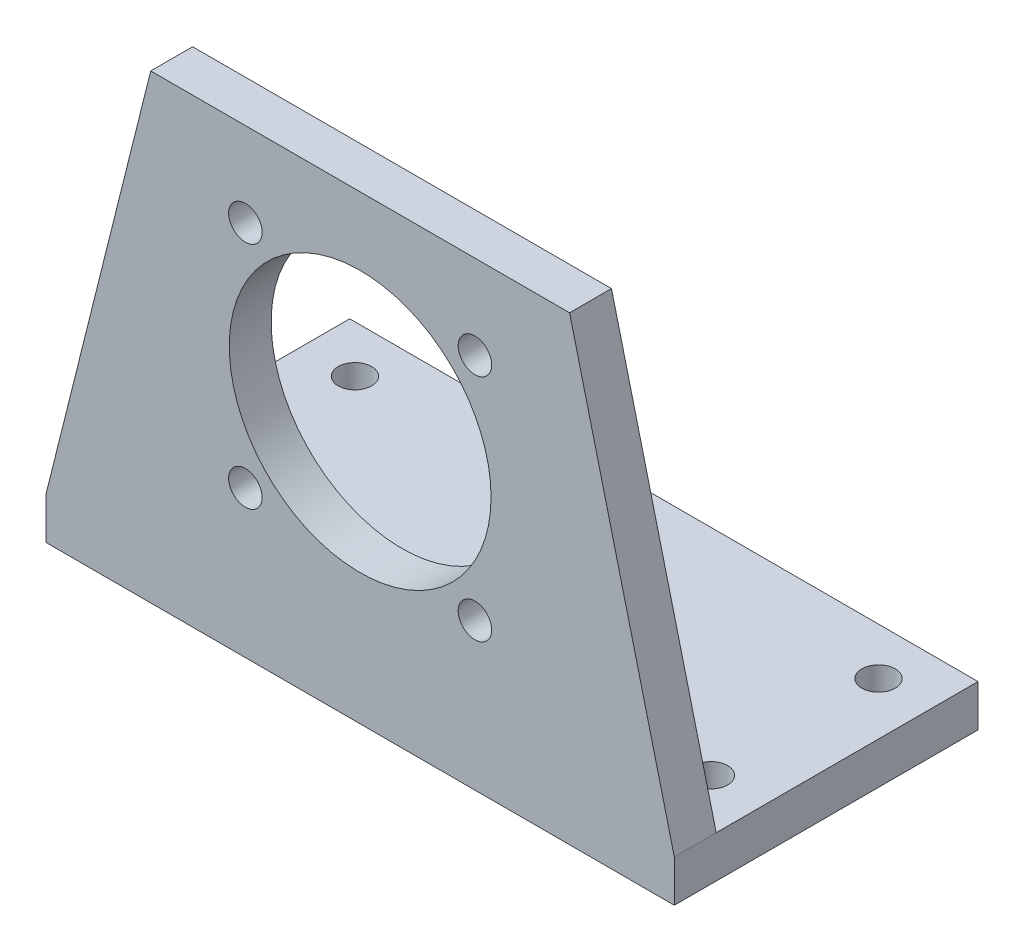
ISO-10303-21;
HEADER;
FILE_DESCRIPTION(('STEP AP214'),'2;1');
FILE_NAME('part.step','',(''),(''),'','','');
FILE_SCHEMA(('AUTOMOTIVE_DESIGN { 1 0 10303 214 1 1 1 1 }'));
ENDSEC;
DATA;
#1=APPLICATION_CONTEXT('core data for automotive mechanical design processes');
#2=APPLICATION_PROTOCOL_DEFINITION('international standard','automotive_design',2000,#1);
#3=PRODUCT_CONTEXT('',#1,'mechanical');
#4=PRODUCT('Part','Part','',(#3));
#5=PRODUCT_RELATED_PRODUCT_CATEGORY('part','',(#4));
#6=PRODUCT_DEFINITION_FORMATION('','',#4);
#7=PRODUCT_DEFINITION_CONTEXT('part definition',#1,'design');
#8=PRODUCT_DEFINITION('design','',#6,#7);
#9=PRODUCT_DEFINITION_SHAPE('','',#8);
#10=(LENGTH_UNIT() NAMED_UNIT(*) SI_UNIT(.MILLI.,.METRE.));
#11=(NAMED_UNIT(*) PLANE_ANGLE_UNIT() SI_UNIT($,.RADIAN.));
#12=(NAMED_UNIT(*) SI_UNIT($,.STERADIAN.) SOLID_ANGLE_UNIT());
#13=UNCERTAINTY_MEASURE_WITH_UNIT(LENGTH_MEASURE(1.E-05),#10,'distance_accuracy_value','');
#14=(GEOMETRIC_REPRESENTATION_CONTEXT(3) GLOBAL_UNCERTAINTY_ASSIGNED_CONTEXT((#13)) GLOBAL_UNIT_ASSIGNED_CONTEXT((#10,
#11,#12)) REPRESENTATION_CONTEXT('',''));
#15=CARTESIAN_POINT('',(0.,0.,0.));
#16=DIRECTION('',(0.,0.,1.));
#17=DIRECTION('',(1.,0.,0.));
#18=AXIS2_PLACEMENT_3D('',#15,#16,#17);
#19=CARTESIAN_POINT('',(0.,0.,0.));
#20=DIRECTION('',(0.,0.,1.));
#21=DIRECTION('',(1.,0.,0.));
#22=AXIS2_PLACEMENT_3D('',#19,#20,#21);
#23=PLANE('',#22);
#24=CARTESIAN_POINT('',(14.1721015894927,10.9601551083911,0.));
#25=DIRECTION('',(0.,0.,1.));
#26=DIRECTION('',(1.,0.,0.));
#27=AXIS2_PLACEMENT_3D('',#24,#25,#26);
#28=CIRCLE('',#27,1.59999999999982);
#29=CARTESIAN_POINT('',(15.7721015894925,10.9601551083911,0.));
#30=VERTEX_POINT('',#29);
#31=EDGE_CURVE('E136',#30,#30,#28,.T.);
#32=ORIENTED_EDGE('',*,*,#31,.T.);
#33=EDGE_LOOP('',(#32));
#34=FACE_BOUND('',#33,.T.);
#35=CARTESIAN_POINT('',(3.21194648110178,2.22044604925031E-13,0.));
#36=DIRECTION('',(0.,0.,1.));
#37=DIRECTION('',(1.,0.,0.));
#38=AXIS2_PLACEMENT_3D('',#35,#36,#37);
#39=CIRCLE('',#38,12.5000000000011);
#40=CARTESIAN_POINT('',(15.7119464811028,2.22044604925031E-13,0.));
#41=VERTEX_POINT('',#40);
#42=EDGE_CURVE('E133',#41,#41,#39,.T.);
#43=ORIENTED_EDGE('',*,*,#42,.T.);
#44=EDGE_LOOP('',(#43));
#45=FACE_BOUND('',#44,.T.);
#46=CARTESIAN_POINT('',(-7.74820862728909,10.960155108392,0.));
#47=DIRECTION('',(0.,0.,1.));
#48=DIRECTION('',(1.,0.,0.));
#49=AXIS2_PLACEMENT_3D('',#46,#47,#48);
#50=CIRCLE('',#49,1.59999999999982);
#51=CARTESIAN_POINT('',(-6.14820862728926,10.960155108392,0.));
#52=VERTEX_POINT('',#51);
#53=EDGE_CURVE('E130',#52,#52,#50,.T.);
#54=ORIENTED_EDGE('',*,*,#53,.T.);
#55=EDGE_LOOP('',(#54));
#56=FACE_BOUND('',#55,.T.);
#57=CARTESIAN_POINT('',(-7.74820862728908,-10.9601551083911,0.));
#58=DIRECTION('',(0.,0.,1.));
#59=DIRECTION('',(1.,0.,0.));
#60=AXIS2_PLACEMENT_3D('',#57,#58,#59);
#61=CIRCLE('',#60,1.59999999999982);
#62=CARTESIAN_POINT('',(-6.14820862728926,-10.9601551083911,0.));
#63=VERTEX_POINT('',#62);
#64=EDGE_CURVE('E126',#63,#63,#61,.T.);
#65=ORIENTED_EDGE('',*,*,#64,.T.);
#66=EDGE_LOOP('',(#65));
#67=FACE_BOUND('',#66,.T.);
#68=CARTESIAN_POINT('',(14.1721015894936,-10.9601551083915,0.));
#69=DIRECTION('',(0.,0.,1.));
#70=DIRECTION('',(1.,0.,0.));
#71=AXIS2_PLACEMENT_3D('',#68,#69,#70);
#72=CIRCLE('',#71,1.59999999999982);
#73=CARTESIAN_POINT('',(15.7721015894934,-10.9601551083915,0.));
#74=VERTEX_POINT('',#73);
#75=EDGE_CURVE('E123',#74,#74,#72,.T.);
#76=ORIENTED_EDGE('',*,*,#75,.T.);
#77=EDGE_LOOP('',(#76));
#78=FACE_BOUND('',#77,.T.);
#79=DIRECTION('',(1.,0.,0.));
#80=VECTOR('',#79,1.);
#81=CARTESIAN_POINT('',(33.2119464811003,-20.9999999999997,0.));
#82=LINE('',#81,#80);
#83=CARTESIAN_POINT('',(-26.7880535188993,-21.0000000000001,0.));
#84=VERTEX_POINT('',#83);
#85=CARTESIAN_POINT('',(33.2119464811003,-20.9999999999997,0.));
#86=VERTEX_POINT('',#85);
#87=EDGE_CURVE('E68',#84,#86,#82,.T.);
#88=ORIENTED_EDGE('',*,*,#87,.F.);
#89=DIRECTION('',(-0.242535625036366,-0.970142500145324,0.));
#90=VECTOR('',#89,1.);
#91=CARTESIAN_POINT('',(-20.271109194257,5.06777729856545,0.));
#92=LINE('',#91,#90);
#93=CARTESIAN_POINT('',(-16.7880535188978,19.0000000000003,0.));
#94=VERTEX_POINT('',#93);
#95=EDGE_CURVE('E142',#94,#84,#92,.T.);
#96=ORIENTED_EDGE('',*,*,#95,.F.);
#97=DIRECTION('',(-1.,0.,0.));
#98=VECTOR('',#97,1.);
#99=CARTESIAN_POINT('',(0.,18.9999999999999,0.));
#100=LINE('',#99,#98);
#101=CARTESIAN_POINT('',(23.2119464811022,18.9999999999999,0.));
#102=VERTEX_POINT('',#101);
#103=EDGE_CURVE('E139',#102,#94,#100,.T.);
#104=ORIENTED_EDGE('',*,*,#103,.F.);
#105=DIRECTION('',(-0.242535625036287,0.970142500145343,0.));
#106=VECTOR('',#105,1.);
#107=CARTESIAN_POINT('',(26.3171260998606,6.5792815249639,0.));
#108=LINE('',#107,#106);
#109=EDGE_CURVE('E74',#86,#102,#108,.T.);
#110=ORIENTED_EDGE('',*,*,#109,.F.);
#111=EDGE_LOOP('',(#88,#96,#104,#110));
#112=FACE_BOUND('',#111,.T.);
#113=ADVANCED_FACE('F34',(#34,#45,#56,#67,#78,#112),#23,.F.);
#114=CARTESIAN_POINT('',(0.,18.9999999999999,4.00000000000005));
#115=DIRECTION('',(0.,-1.,0.));
#116=DIRECTION('',(0.,0.,-1.));
#117=AXIS2_PLACEMENT_3D('',#114,#115,#116);
#118=PLANE('',#117);
#119=ORIENTED_EDGE('',*,*,#103,.T.);
#120=DIRECTION('',(0.,0.,-1.));
#121=VECTOR('',#120,1.);
#122=CARTESIAN_POINT('',(-16.7880535188978,19.0000000000003,4.00000000000006));
#123=LINE('',#122,#121);
#124=CARTESIAN_POINT('',(-16.7880535188978,19.0000000000003,4.00000000000006));
#125=VERTEX_POINT('',#124);
#126=EDGE_CURVE('E11',#125,#94,#123,.T.);
#127=ORIENTED_EDGE('',*,*,#126,.F.);
#128=DIRECTION('',(-1.,0.,0.));
#129=VECTOR('',#128,1.);
#130=CARTESIAN_POINT('',(0.,18.9999999999999,4.00000000000005));
#131=LINE('',#130,#129);
#132=CARTESIAN_POINT('',(23.2119464811022,18.9999999999999,4.00000000000006));
#133=VERTEX_POINT('',#132);
#134=EDGE_CURVE('E201',#133,#125,#131,.T.);
#135=ORIENTED_EDGE('',*,*,#134,.F.);
#136=DIRECTION('',(0.,0.,-1.));
#137=VECTOR('',#136,1.);
#138=CARTESIAN_POINT('',(23.2119464811022,18.9999999999999,4.00000000000006));
#139=LINE('',#138,#137);
#140=EDGE_CURVE('E119',#133,#102,#139,.T.);
#141=ORIENTED_EDGE('',*,*,#140,.T.);
#142=EDGE_LOOP('',(#119,#127,#135,#141));
#143=FACE_BOUND('',#142,.T.);
#144=ADVANCED_FACE('F230',(#143),#118,.F.);
#145=CARTESIAN_POINT('',(-20.271109194257,5.06777729856545,4.));
#146=DIRECTION('',(0.970142500145324,-0.242535625036366,0.));
#147=DIRECTION('',(0.242535625036366,0.970142500145324,0.));
#148=AXIS2_PLACEMENT_3D('',#145,#146,#147);
#149=PLANE('',#148);
#150=ORIENTED_EDGE('',*,*,#95,.T.);
#151=DIRECTION('',(0.,0.,-1.));
#152=VECTOR('',#151,1.);
#153=CARTESIAN_POINT('',(-26.7880535188993,-21.0000000000001,4.00000000000006));
#154=LINE('',#153,#152);
#155=CARTESIAN_POINT('',(-26.7880535188993,-21.0000000000001,4.00000000000006));
#156=VERTEX_POINT('',#155);
#157=EDGE_CURVE('E44',#156,#84,#154,.T.);
#158=ORIENTED_EDGE('',*,*,#157,.F.);
#159=DIRECTION('',(-0.242535625036366,-0.970142500145324,0.));
#160=VECTOR('',#159,1.);
#161=CARTESIAN_POINT('',(-20.271109194257,5.06777729856545,4.));
#162=LINE('',#161,#160);
#163=EDGE_CURVE('E82',#125,#156,#162,.T.);
#164=ORIENTED_EDGE('',*,*,#163,.F.);
#165=ORIENTED_EDGE('',*,*,#126,.T.);
#166=EDGE_LOOP('',(#150,#158,#164,#165));
#167=FACE_BOUND('',#166,.T.);
#168=ADVANCED_FACE('F236',(#167),#149,.F.);
#169=CARTESIAN_POINT('',(-26.7880535188993,4.44089209850063E-13,4.));
#170=DIRECTION('',(-1.,0.,0.));
#171=DIRECTION('',(0.,0.,1.));
#172=AXIS2_PLACEMENT_3D('',#169,#170,#171);
#173=PLANE('',#172);
#174=ORIENTED_EDGE('',*,*,#157,.T.);
#175=DIRECTION('',(0.,0.,1.));
#176=VECTOR('',#175,1.);
#177=CARTESIAN_POINT('',(-26.7880535188993,-20.9999999999997,-25.));
#178=LINE('',#177,#176);
#179=CARTESIAN_POINT('',(-26.7880535188993,-20.9999999999997,-25.));
#180=VERTEX_POINT('',#179);
#181=EDGE_CURVE('E127',#180,#84,#178,.T.);
#182=ORIENTED_EDGE('',*,*,#181,.F.);
#183=DIRECTION('',(0.,1.,0.));
#184=VECTOR('',#183,1.);
#185=CARTESIAN_POINT('',(-26.7880535188993,-20.9999999999997,-25.));
#186=LINE('',#185,#184);
#187=CARTESIAN_POINT('',(-26.7880535188993,-24.9999999999997,-25.));
#188=VERTEX_POINT('',#187);
#189=EDGE_CURVE('E176',#188,#180,#186,.T.);
#190=ORIENTED_EDGE('',*,*,#189,.F.);
#191=DIRECTION('',(0.,0.,-1.));
#192=VECTOR('',#191,1.);
#193=CARTESIAN_POINT('',(-26.7880535188993,-24.9999999999997,4.00000000000006));
#194=LINE('',#193,#192);
#195=CARTESIAN_POINT('',(-26.7880535188993,-24.9999999999997,4.00000000000006));
#196=VERTEX_POINT('',#195);
#197=EDGE_CURVE('E107',#196,#188,#194,.T.);
#198=ORIENTED_EDGE('',*,*,#197,.F.);
#199=DIRECTION('',(0.,1.,0.));
#200=VECTOR('',#199,1.);
#201=CARTESIAN_POINT('',(-26.7880535188993,4.44089209850063E-13,4.));
#202=LINE('',#201,#200);
#203=EDGE_CURVE('E114',#196,#156,#202,.T.);
#204=ORIENTED_EDGE('',*,*,#203,.T.);
#205=EDGE_LOOP('',(#174,#182,#190,#198,#204));
#206=FACE_BOUND('',#205,.T.);
#207=ADVANCED_FACE('F204',(#206),#173,.T.);
#208=CARTESIAN_POINT('',(0.,-25.0000000000001,4.));
#209=DIRECTION('',(0.,-1.,0.));
#210=DIRECTION('',(0.,0.,-1.));
#211=AXIS2_PLACEMENT_3D('',#208,#209,#210);
#212=PLANE('',#211);
#213=CARTESIAN_POINT('',(28.2119464811003,-25.0000000000001,-4.49999999999995));
#214=DIRECTION('',(0.,-1.,0.));
#215=DIRECTION('',(0.,0.,-1.));
#216=AXIS2_PLACEMENT_3D('',#213,#214,#215);
#217=CIRCLE('',#216,1.6);
#218=CARTESIAN_POINT('',(28.2119464811003,-25.0000000000001,-6.09999999999995));
#219=VERTEX_POINT('',#218);
#220=EDGE_CURVE('E158',#219,#219,#217,.T.);
#221=ORIENTED_EDGE('',*,*,#220,.F.);
#222=EDGE_LOOP('',(#221));
#223=FACE_BOUND('',#222,.T.);
#224=CARTESIAN_POINT('',(28.2119464811003,-25.0000000000001,-20.5));
#225=DIRECTION('',(0.,-1.,0.));
#226=DIRECTION('',(0.,0.,-1.));
#227=AXIS2_PLACEMENT_3D('',#224,#225,#226);
#228=CIRCLE('',#227,1.6);
#229=CARTESIAN_POINT('',(28.2119464811003,-25.0000000000001,-22.0999999999999));
#230=VERTEX_POINT('',#229);
#231=EDGE_CURVE('E360',#230,#230,#228,.T.);
#232=ORIENTED_EDGE('',*,*,#231,.F.);
#233=EDGE_LOOP('',(#232));
#234=FACE_BOUND('',#233,.T.);
#235=CARTESIAN_POINT('',(-21.7880535188993,-24.9999999999997,-20.5));
#236=DIRECTION('',(0.,-1.,0.));
#237=DIRECTION('',(0.,0.,-1.));
#238=AXIS2_PLACEMENT_3D('',#235,#236,#237);
#239=CIRCLE('',#238,1.6);
#240=CARTESIAN_POINT('',(-21.7880535188993,-24.9999999999997,-22.0999999999999));
#241=VERTEX_POINT('',#240);
#242=EDGE_CURVE('E171',#241,#241,#239,.T.);
#243=ORIENTED_EDGE('',*,*,#242,.F.);
#244=EDGE_LOOP('',(#243));
#245=FACE_BOUND('',#244,.T.);
#246=CARTESIAN_POINT('',(-21.7880535188993,-24.9999999999997,-4.49999999999995));
#247=DIRECTION('',(0.,-1.,0.));
#248=DIRECTION('',(0.,0.,-1.));
#249=AXIS2_PLACEMENT_3D('',#246,#247,#248);
#250=CIRCLE('',#249,1.6);
#251=CARTESIAN_POINT('',(-21.7880535188993,-24.9999999999997,-6.09999999999995));
#252=VERTEX_POINT('',#251);
#253=EDGE_CURVE('E154',#252,#252,#250,.T.);
#254=ORIENTED_EDGE('',*,*,#253,.F.);
#255=EDGE_LOOP('',(#254));
#256=FACE_BOUND('',#255,.T.);
#257=ORIENTED_EDGE('',*,*,#197,.T.);
#258=DIRECTION('',(-1.,0.,0.));
#259=VECTOR('',#258,1.);
#260=CARTESIAN_POINT('',(33.2119464811003,-25.0000000000001,-24.9999999999999));
#261=LINE('',#260,#259);
#262=CARTESIAN_POINT('',(33.2119464811003,-25.0000000000001,-24.9999999999999));
#263=VERTEX_POINT('',#262);
#264=EDGE_CURVE('E102',#263,#188,#261,.T.);
#265=ORIENTED_EDGE('',*,*,#264,.F.);
#266=DIRECTION('',(0.,0.,-1.));
#267=VECTOR('',#266,1.);
#268=CARTESIAN_POINT('',(33.2119464811003,-24.9999999999997,4.00000000000006));
#269=LINE('',#268,#267);
#270=CARTESIAN_POINT('',(33.2119464811003,-24.9999999999997,4.00000000000006));
#271=VERTEX_POINT('',#270);
#272=EDGE_CURVE('E95',#271,#263,#269,.T.);
#273=ORIENTED_EDGE('',*,*,#272,.F.);
#274=DIRECTION('',(-1.,0.,0.));
#275=VECTOR('',#274,1.);
#276=CARTESIAN_POINT('',(0.,-25.0000000000001,4.));
#277=LINE('',#276,#275);
#278=EDGE_CURVE('E99',#271,#196,#277,.T.);
#279=ORIENTED_EDGE('',*,*,#278,.T.);
#280=EDGE_LOOP('',(#257,#265,#273,#279));
#281=FACE_BOUND('',#280,.T.);
#282=ADVANCED_FACE('F98',(#223,#234,#245,#256,#281),#212,.T.);
#283=CARTESIAN_POINT('',(33.2119464811003,4.44089209850063E-13,4.00000000000005));
#284=DIRECTION('',(1.,0.,0.));
#285=DIRECTION('',(0.,0.,-1.));
#286=AXIS2_PLACEMENT_3D('',#283,#284,#285);
#287=PLANE('',#286);
#288=ORIENTED_EDGE('',*,*,#272,.T.);
#289=DIRECTION('',(0.,-1.,0.));
#290=VECTOR('',#289,1.);
#291=CARTESIAN_POINT('',(33.2119464811003,-21.0000000000001,-24.9999999999999));
#292=LINE('',#291,#290);
#293=CARTESIAN_POINT('',(33.2119464811003,-21.0000000000001,-24.9999999999999));
#294=VERTEX_POINT('',#293);
#295=EDGE_CURVE('E173',#294,#263,#292,.T.);
#296=ORIENTED_EDGE('',*,*,#295,.F.);
#297=DIRECTION('',(0.,0.,1.));
#298=VECTOR('',#297,1.);
#299=CARTESIAN_POINT('',(33.2119464811003,-21.0000000000001,-24.9999999999999));
#300=LINE('',#299,#298);
#301=EDGE_CURVE('E182',#294,#86,#300,.T.);
#302=ORIENTED_EDGE('',*,*,#301,.T.);
#303=DIRECTION('',(0.,0.,-1.));
#304=VECTOR('',#303,1.);
#305=CARTESIAN_POINT('',(33.2119464811003,-20.9999999999997,4.00000000000006));
#306=LINE('',#305,#304);
#307=CARTESIAN_POINT('',(33.2119464811003,-20.9999999999997,4.00000000000006));
#308=VERTEX_POINT('',#307);
#309=EDGE_CURVE('E108',#308,#86,#306,.T.);
#310=ORIENTED_EDGE('',*,*,#309,.F.);
#311=DIRECTION('',(0.,-1.,0.));
#312=VECTOR('',#311,1.);
#313=CARTESIAN_POINT('',(33.2119464811003,4.44089209850063E-13,4.00000000000005));
#314=LINE('',#313,#312);
#315=EDGE_CURVE('E112',#308,#271,#314,.T.);
#316=ORIENTED_EDGE('',*,*,#315,.T.);
#317=EDGE_LOOP('',(#288,#296,#302,#310,#316));
#318=FACE_BOUND('',#317,.T.);
#319=ADVANCED_FACE('F116',(#318),#287,.T.);
#320=CARTESIAN_POINT('',(14.1721015894927,10.9601551083911,4.));
#321=DIRECTION('',(0.,0.,-1.));
#322=DIRECTION('',(-1.,0.,0.));
#323=AXIS2_PLACEMENT_3D('',#320,#321,#322);
#324=CYLINDRICAL_SURFACE('',#323,1.59999999999982);
#325=CARTESIAN_POINT('',(14.1721015894927,10.9601551083911,4.));
#326=DIRECTION('',(0.,0.,1.));
#327=DIRECTION('',(1.,0.,0.));
#328=AXIS2_PLACEMENT_3D('',#325,#326,#327);
#329=CIRCLE('',#328,1.59999999999982);
#330=CARTESIAN_POINT('',(15.7721015894925,10.9601551083911,4.));
#331=VERTEX_POINT('',#330);
#332=EDGE_CURVE('E198',#331,#331,#329,.T.);
#333=ORIENTED_EDGE('',*,*,#332,.T.);
#334=EDGE_LOOP('',(#333));
#335=FACE_BOUND('',#334,.T.);
#336=ORIENTED_EDGE('',*,*,#31,.F.);
#337=EDGE_LOOP('',(#336));
#338=FACE_BOUND('',#337,.T.);
#339=ADVANCED_FACE('F245',(#335,#338),#324,.F.);
#340=CARTESIAN_POINT('',(3.21194648110178,2.22044604925031E-13,4.));
#341=DIRECTION('',(0.,0.,-1.));
#342=DIRECTION('',(-1.,0.,0.));
#343=AXIS2_PLACEMENT_3D('',#340,#341,#342);
#344=CYLINDRICAL_SURFACE('',#343,12.5000000000011);
#345=CARTESIAN_POINT('',(3.21194648110178,2.22044604925031E-13,4.));
#346=DIRECTION('',(0.,0.,1.));
#347=DIRECTION('',(1.,0.,0.));
#348=AXIS2_PLACEMENT_3D('',#345,#346,#347);
#349=CIRCLE('',#348,12.5000000000011);
#350=CARTESIAN_POINT('',(15.7119464811028,2.22044604925031E-13,4.));
#351=VERTEX_POINT('',#350);
#352=EDGE_CURVE('E195',#351,#351,#349,.T.);
#353=ORIENTED_EDGE('',*,*,#352,.T.);
#354=EDGE_LOOP('',(#353));
#355=FACE_BOUND('',#354,.T.);
#356=ORIENTED_EDGE('',*,*,#42,.F.);
#357=EDGE_LOOP('',(#356));
#358=FACE_BOUND('',#357,.T.);
#359=ADVANCED_FACE('F255',(#355,#358),#344,.F.);
#360=CARTESIAN_POINT('',(-7.74820862728909,10.960155108392,4.00000000000005));
#361=DIRECTION('',(0.,0.,-1.));
#362=DIRECTION('',(-1.,0.,0.));
#363=AXIS2_PLACEMENT_3D('',#360,#361,#362);
#364=CYLINDRICAL_SURFACE('',#363,1.59999999999982);
#365=CARTESIAN_POINT('',(-7.74820862728909,10.960155108392,4.00000000000005));
#366=DIRECTION('',(0.,0.,1.));
#367=DIRECTION('',(1.,0.,0.));
#368=AXIS2_PLACEMENT_3D('',#365,#366,#367);
#369=CIRCLE('',#368,1.59999999999982);
#370=CARTESIAN_POINT('',(-6.14820862728926,10.960155108392,4.00000000000005));
#371=VERTEX_POINT('',#370);
#372=EDGE_CURVE('E192',#371,#371,#369,.T.);
#373=ORIENTED_EDGE('',*,*,#372,.T.);
#374=EDGE_LOOP('',(#373));
#375=FACE_BOUND('',#374,.T.);
#376=ORIENTED_EDGE('',*,*,#53,.F.);
#377=EDGE_LOOP('',(#376));
#378=FACE_BOUND('',#377,.T.);
#379=ADVANCED_FACE('F259',(#375,#378),#364,.F.);
#380=CARTESIAN_POINT('',(-7.74820862728909,-10.9601551083911,4.00000000000006));
#381=DIRECTION('',(0.,0.,-1.));
#382=DIRECTION('',(-1.,0.,0.));
#383=AXIS2_PLACEMENT_3D('',#380,#381,#382);
#384=CYLINDRICAL_SURFACE('',#383,1.59999999999982);
#385=CARTESIAN_POINT('',(-7.74820862728909,-10.9601551083911,4.00000000000006));
#386=DIRECTION('',(0.,0.,1.));
#387=DIRECTION('',(1.,0.,0.));
#388=AXIS2_PLACEMENT_3D('',#385,#386,#387);
#389=CIRCLE('',#388,1.59999999999982);
#390=CARTESIAN_POINT('',(-6.14820862728926,-10.9601551083911,4.00000000000006));
#391=VERTEX_POINT('',#390);
#392=EDGE_CURVE('E189',#391,#391,#389,.T.);
#393=ORIENTED_EDGE('',*,*,#392,.T.);
#394=EDGE_LOOP('',(#393));
#395=FACE_BOUND('',#394,.T.);
#396=ORIENTED_EDGE('',*,*,#64,.F.);
#397=EDGE_LOOP('',(#396));
#398=FACE_BOUND('',#397,.T.);
#399=ADVANCED_FACE('F262',(#395,#398),#384,.F.);
#400=CARTESIAN_POINT('',(14.1721015894936,-10.9601551083915,4.00000000000005));
#401=DIRECTION('',(0.,0.,-1.));
#402=DIRECTION('',(-1.,0.,0.));
#403=AXIS2_PLACEMENT_3D('',#400,#401,#402);
#404=CYLINDRICAL_SURFACE('',#403,1.59999999999982);
#405=CARTESIAN_POINT('',(14.1721015894936,-10.9601551083915,4.00000000000005));
#406=DIRECTION('',(0.,0.,1.));
#407=DIRECTION('',(1.,0.,0.));
#408=AXIS2_PLACEMENT_3D('',#405,#406,#407);
#409=CIRCLE('',#408,1.59999999999982);
#410=CARTESIAN_POINT('',(15.7721015894934,-10.9601551083915,4.00000000000005));
#411=VERTEX_POINT('',#410);
#412=EDGE_CURVE('E146',#411,#411,#409,.T.);
#413=ORIENTED_EDGE('',*,*,#412,.T.);
#414=EDGE_LOOP('',(#413));
#415=FACE_BOUND('',#414,.T.);
#416=ORIENTED_EDGE('',*,*,#75,.F.);
#417=EDGE_LOOP('',(#416));
#418=FACE_BOUND('',#417,.T.);
#419=ADVANCED_FACE('F36',(#415,#418),#404,.F.);
#420=CARTESIAN_POINT('',(26.3171260998606,6.5792815249639,4.));
#421=DIRECTION('',(-0.970142500145343,-0.242535625036287,0.));
#422=DIRECTION('',(0.242535625036287,-0.970142500145343,0.));
#423=AXIS2_PLACEMENT_3D('',#420,#421,#422);
#424=PLANE('',#423);
#425=ORIENTED_EDGE('',*,*,#109,.T.);
#426=ORIENTED_EDGE('',*,*,#140,.F.);
#427=DIRECTION('',(-0.242535625036287,0.970142500145343,0.));
#428=VECTOR('',#427,1.);
#429=CARTESIAN_POINT('',(26.3171260998606,6.5792815249639,4.));
#430=LINE('',#429,#428);
#431=EDGE_CURVE('E53',#308,#133,#430,.T.);
#432=ORIENTED_EDGE('',*,*,#431,.F.);
#433=ORIENTED_EDGE('',*,*,#309,.T.);
#434=EDGE_LOOP('',(#425,#426,#432,#433));
#435=FACE_BOUND('',#434,.T.);
#436=ADVANCED_FACE('F226',(#435),#424,.F.);
#437=CARTESIAN_POINT('',(0.,0.,4.));
#438=DIRECTION('',(0.,0.,1.));
#439=DIRECTION('',(1.,0.,0.));
#440=AXIS2_PLACEMENT_3D('',#437,#438,#439);
#441=PLANE('',#440);
#442=ORIENTED_EDGE('',*,*,#412,.F.);
#443=EDGE_LOOP('',(#442));
#444=FACE_BOUND('',#443,.T.);
#445=ORIENTED_EDGE('',*,*,#392,.F.);
#446=EDGE_LOOP('',(#445));
#447=FACE_BOUND('',#446,.T.);
#448=ORIENTED_EDGE('',*,*,#372,.F.);
#449=EDGE_LOOP('',(#448));
#450=FACE_BOUND('',#449,.T.);
#451=ORIENTED_EDGE('',*,*,#352,.F.);
#452=EDGE_LOOP('',(#451));
#453=FACE_BOUND('',#452,.T.);
#454=ORIENTED_EDGE('',*,*,#332,.F.);
#455=EDGE_LOOP('',(#454));
#456=FACE_BOUND('',#455,.T.);
#457=ORIENTED_EDGE('',*,*,#134,.T.);
#458=ORIENTED_EDGE('',*,*,#163,.T.);
#459=ORIENTED_EDGE('',*,*,#203,.F.);
#460=ORIENTED_EDGE('',*,*,#278,.F.);
#461=ORIENTED_EDGE('',*,*,#315,.F.);
#462=ORIENTED_EDGE('',*,*,#431,.T.);
#463=EDGE_LOOP('',(#457,#458,#459,#460,#461,#462));
#464=FACE_BOUND('',#463,.T.);
#465=ADVANCED_FACE('F111',(#444,#447,#450,#453,#456,#464),#441,.T.);
#466=CARTESIAN_POINT('',(33.2119464811003,-21.0000000000001,-24.9999999999999));
#467=DIRECTION('',(0.,-1.,0.));
#468=DIRECTION('',(0.,0.,-1.));
#469=AXIS2_PLACEMENT_3D('',#466,#467,#468);
#470=PLANE('',#469);
#471=CARTESIAN_POINT('',(28.2119464811003,-21.0000000000001,-4.49999999999995));
#472=DIRECTION('',(0.,-1.,0.));
#473=DIRECTION('',(0.,0.,-1.));
#474=AXIS2_PLACEMENT_3D('',#471,#472,#473);
#475=CIRCLE('',#474,1.6);
#476=CARTESIAN_POINT('',(28.2119464811003,-21.0000000000001,-6.09999999999995));
#477=VERTEX_POINT('',#476);
#478=EDGE_CURVE('E38',#477,#477,#475,.T.);
#479=ORIENTED_EDGE('',*,*,#478,.T.);
#480=EDGE_LOOP('',(#479));
#481=FACE_BOUND('',#480,.T.);
#482=CARTESIAN_POINT('',(28.2119464811003,-21.0000000000001,-20.5));
#483=DIRECTION('',(0.,-1.,0.));
#484=DIRECTION('',(0.,0.,-1.));
#485=AXIS2_PLACEMENT_3D('',#482,#483,#484);
#486=CIRCLE('',#485,1.6);
#487=CARTESIAN_POINT('',(28.2119464811003,-21.0000000000001,-22.0999999999999));
#488=VERTEX_POINT('',#487);
#489=EDGE_CURVE('E157',#488,#488,#486,.T.);
#490=ORIENTED_EDGE('',*,*,#489,.T.);
#491=EDGE_LOOP('',(#490));
#492=FACE_BOUND('',#491,.T.);
#493=CARTESIAN_POINT('',(-21.7880535188993,-20.9999999999997,-20.5));
#494=DIRECTION('',(0.,-1.,0.));
#495=DIRECTION('',(0.,0.,-1.));
#496=AXIS2_PLACEMENT_3D('',#493,#494,#495);
#497=CIRCLE('',#496,1.6);
#498=CARTESIAN_POINT('',(-21.7880535188993,-20.9999999999997,-22.0999999999999));
#499=VERTEX_POINT('',#498);
#500=EDGE_CURVE('E155',#499,#499,#497,.T.);
#501=ORIENTED_EDGE('',*,*,#500,.T.);
#502=EDGE_LOOP('',(#501));
#503=FACE_BOUND('',#502,.T.);
#504=CARTESIAN_POINT('',(-21.7880535188993,-20.9999999999997,-4.49999999999995));
#505=DIRECTION('',(0.,-1.,0.));
#506=DIRECTION('',(0.,0.,-1.));
#507=AXIS2_PLACEMENT_3D('',#504,#505,#506);
#508=CIRCLE('',#507,1.6);
#509=CARTESIAN_POINT('',(-21.7880535188993,-20.9999999999997,-6.09999999999995));
#510=VERTEX_POINT('',#509);
#511=EDGE_CURVE('E151',#510,#510,#508,.T.);
#512=ORIENTED_EDGE('',*,*,#511,.T.);
#513=EDGE_LOOP('',(#512));
#514=FACE_BOUND('',#513,.T.);
#515=ORIENTED_EDGE('',*,*,#87,.T.);
#516=ORIENTED_EDGE('',*,*,#301,.F.);
#517=DIRECTION('',(1.,0.,0.));
#518=VECTOR('',#517,1.);
#519=CARTESIAN_POINT('',(33.2119464811003,-21.0000000000001,-24.9999999999999));
#520=LINE('',#519,#518);
#521=EDGE_CURVE('E179',#180,#294,#520,.T.);
#522=ORIENTED_EDGE('',*,*,#521,.F.);
#523=ORIENTED_EDGE('',*,*,#181,.T.);
#524=EDGE_LOOP('',(#515,#516,#522,#523));
#525=FACE_BOUND('',#524,.T.);
#526=ADVANCED_FACE('F217',(#481,#492,#503,#514,#525),#470,.F.);
#527=CARTESIAN_POINT('',(0.,4.44089209850063E-13,-25.));
#528=DIRECTION('',(0.,0.,-1.));
#529=DIRECTION('',(-1.,0.,0.));
#530=AXIS2_PLACEMENT_3D('',#527,#528,#529);
#531=PLANE('',#530);
#532=ORIENTED_EDGE('',*,*,#295,.T.);
#533=ORIENTED_EDGE('',*,*,#264,.T.);
#534=ORIENTED_EDGE('',*,*,#189,.T.);
#535=ORIENTED_EDGE('',*,*,#521,.T.);
#536=EDGE_LOOP('',(#532,#533,#534,#535));
#537=FACE_BOUND('',#536,.T.);
#538=ADVANCED_FACE('F211',(#537),#531,.T.);
#539=CARTESIAN_POINT('',(-21.7880535188993,2.22044604925031E-13,-4.49999999999999));
#540=DIRECTION('',(0.,-1.,0.));
#541=DIRECTION('',(0.,0.,-1.));
#542=AXIS2_PLACEMENT_3D('',#539,#540,#541);
#543=CYLINDRICAL_SURFACE('',#542,1.6);
#544=ORIENTED_EDGE('',*,*,#253,.T.);
#545=EDGE_LOOP('',(#544));
#546=FACE_BOUND('',#545,.T.);
#547=ORIENTED_EDGE('',*,*,#511,.F.);
#548=EDGE_LOOP('',(#547));
#549=FACE_BOUND('',#548,.T.);
#550=ADVANCED_FACE('F224',(#546,#549),#543,.F.);
#551=CARTESIAN_POINT('',(-21.7880535188993,2.22044604925031E-13,-20.5));
#552=DIRECTION('',(0.,-1.,0.));
#553=DIRECTION('',(0.,0.,-1.));
#554=AXIS2_PLACEMENT_3D('',#551,#552,#553);
#555=CYLINDRICAL_SURFACE('',#554,1.6);
#556=ORIENTED_EDGE('',*,*,#242,.T.);
#557=EDGE_LOOP('',(#556));
#558=FACE_BOUND('',#557,.T.);
#559=ORIENTED_EDGE('',*,*,#500,.F.);
#560=EDGE_LOOP('',(#559));
#561=FACE_BOUND('',#560,.T.);
#562=ADVANCED_FACE('F324',(#558,#561),#555,.F.);
#563=CARTESIAN_POINT('',(28.2119464811003,-1.11022302462516E-13,-20.5));
#564=DIRECTION('',(0.,-1.,0.));
#565=DIRECTION('',(0.,0.,-1.));
#566=AXIS2_PLACEMENT_3D('',#563,#564,#565);
#567=CYLINDRICAL_SURFACE('',#566,1.6);
#568=ORIENTED_EDGE('',*,*,#231,.T.);
#569=EDGE_LOOP('',(#568));
#570=FACE_BOUND('',#569,.T.);
#571=ORIENTED_EDGE('',*,*,#489,.F.);
#572=EDGE_LOOP('',(#571));
#573=FACE_BOUND('',#572,.T.);
#574=ADVANCED_FACE('F333',(#570,#573),#567,.F.);
#575=CARTESIAN_POINT('',(28.2119464811002,-1.11022302462516E-13,-4.49999999999995));
#576=DIRECTION('',(0.,-1.,0.));
#577=DIRECTION('',(0.,0.,-1.));
#578=AXIS2_PLACEMENT_3D('',#575,#576,#577);
#579=CYLINDRICAL_SURFACE('',#578,1.6);
#580=ORIENTED_EDGE('',*,*,#220,.T.);
#581=EDGE_LOOP('',(#580));
#582=FACE_BOUND('',#581,.T.);
#583=ORIENTED_EDGE('',*,*,#478,.F.);
#584=EDGE_LOOP('',(#583));
#585=FACE_BOUND('',#584,.T.);
#586=ADVANCED_FACE('F343',(#582,#585),#579,.F.);
#587=CLOSED_SHELL('',(#113,#144,#168,#207,#282,#319,#339,#359,#379,#399,#419,#436,#465,#526,
#538,#550,#562,#574,#586));
#588=MANIFOLD_SOLID_BREP('B2',#587);
#589=ADVANCED_BREP_SHAPE_REPRESENTATION('',(#18,#588),#14);
#590=SHAPE_DEFINITION_REPRESENTATION(#9,#589);
ENDSEC;
END-ISO-10303-21;
